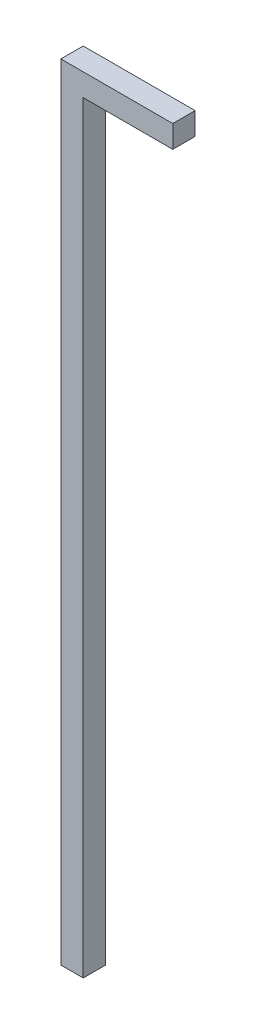
ISO-10303-21;
HEADER;
FILE_DESCRIPTION(('STEP AP214'),'2;1');
FILE_NAME('part.step','',(''),(''),'','','');
FILE_SCHEMA(('AUTOMOTIVE_DESIGN { 1 0 10303 214 1 1 1 1 }'));
ENDSEC;
DATA;
#1=APPLICATION_CONTEXT('core data for automotive mechanical design processes');
#2=APPLICATION_PROTOCOL_DEFINITION('international standard','automotive_design',2000,#1);
#3=PRODUCT_CONTEXT('',#1,'mechanical');
#4=PRODUCT('Part','Part','',(#3));
#5=PRODUCT_RELATED_PRODUCT_CATEGORY('part','',(#4));
#6=PRODUCT_DEFINITION_FORMATION('','',#4);
#7=PRODUCT_DEFINITION_CONTEXT('part definition',#1,'design');
#8=PRODUCT_DEFINITION('design','',#6,#7);
#9=PRODUCT_DEFINITION_SHAPE('','',#8);
#10=(LENGTH_UNIT() NAMED_UNIT(*) SI_UNIT(.MILLI.,.METRE.));
#11=(NAMED_UNIT(*) PLANE_ANGLE_UNIT() SI_UNIT($,.RADIAN.));
#12=(NAMED_UNIT(*) SI_UNIT($,.STERADIAN.) SOLID_ANGLE_UNIT());
#13=UNCERTAINTY_MEASURE_WITH_UNIT(LENGTH_MEASURE(1.E-05),#10,'distance_accuracy_value','');
#14=(GEOMETRIC_REPRESENTATION_CONTEXT(3) GLOBAL_UNCERTAINTY_ASSIGNED_CONTEXT((#13)) GLOBAL_UNIT_ASSIGNED_CONTEXT((#10,
#11,#12)) REPRESENTATION_CONTEXT('',''));
#15=CARTESIAN_POINT('',(0.,0.,0.));
#16=DIRECTION('',(0.,0.,1.));
#17=DIRECTION('',(1.,0.,0.));
#18=AXIS2_PLACEMENT_3D('',#15,#16,#17);
#19=CARTESIAN_POINT('',(-183.974110429448,211.546370143149,20.));
#20=DIRECTION('',(-1.,0.,0.));
#21=DIRECTION('',(0.,0.,1.));
#22=AXIS2_PLACEMENT_3D('',#19,#20,#21);
#23=PLANE('',#22);
#24=DIRECTION('',(0.,1.,0.));
#25=VECTOR('',#24,1.);
#26=CARTESIAN_POINT('',(-183.974110429448,211.546370143149,0.));
#27=LINE('',#26,#25);
#28=CARTESIAN_POINT('',(-183.974110429448,191.546370143149,0.));
#29=VERTEX_POINT('',#28);
#30=CARTESIAN_POINT('',(-183.974110429448,211.546370143149,0.));
#31=VERTEX_POINT('',#30);
#32=EDGE_CURVE('E117',#29,#31,#27,.T.);
#33=ORIENTED_EDGE('',*,*,#32,.T.);
#34=DIRECTION('',(0.,0.,-1.));
#35=VECTOR('',#34,1.);
#36=CARTESIAN_POINT('',(-183.974110429448,211.546370143149,20.));
#37=LINE('',#36,#35);
#38=CARTESIAN_POINT('',(-183.974110429448,211.546370143149,20.));
#39=VERTEX_POINT('',#38);
#40=EDGE_CURVE('E11',#39,#31,#37,.T.);
#41=ORIENTED_EDGE('',*,*,#40,.F.);
#42=DIRECTION('',(0.,1.,0.));
#43=VECTOR('',#42,1.);
#44=CARTESIAN_POINT('',(-183.974110429448,211.546370143149,20.));
#45=LINE('',#44,#43);
#46=CARTESIAN_POINT('',(-183.974110429448,191.546370143149,20.));
#47=VERTEX_POINT('',#46);
#48=EDGE_CURVE('E127',#47,#39,#45,.T.);
#49=ORIENTED_EDGE('',*,*,#48,.F.);
#50=DIRECTION('',(0.,0.,-1.));
#51=VECTOR('',#50,1.);
#52=CARTESIAN_POINT('',(-183.974110429448,191.546370143149,20.));
#53=LINE('',#52,#51);
#54=EDGE_CURVE('E113',#47,#29,#53,.T.);
#55=ORIENTED_EDGE('',*,*,#54,.T.);
#56=EDGE_LOOP('',(#33,#41,#49,#55));
#57=FACE_BOUND('',#56,.T.);
#58=ADVANCED_FACE('F33',(#57),#23,.F.);
#59=CARTESIAN_POINT('',(-183.974110429448,211.546370143149,20.));
#60=DIRECTION('',(0.,-1.,0.));
#61=DIRECTION('',(0.,0.,-1.));
#62=AXIS2_PLACEMENT_3D('',#59,#60,#61);
#63=PLANE('',#62);
#64=DIRECTION('',(-1.,0.,0.));
#65=VECTOR('',#64,1.);
#66=CARTESIAN_POINT('',(-183.974110429448,211.546370143149,0.));
#67=LINE('',#66,#65);
#68=CARTESIAN_POINT('',(-283.974110429448,211.546370143149,0.));
#69=VERTEX_POINT('',#68);
#70=EDGE_CURVE('E120',#31,#69,#67,.T.);
#71=ORIENTED_EDGE('',*,*,#70,.T.);
#72=DIRECTION('',(0.,0.,-1.));
#73=VECTOR('',#72,1.);
#74=CARTESIAN_POINT('',(-283.974110429448,211.546370143149,20.));
#75=LINE('',#74,#73);
#76=CARTESIAN_POINT('',(-283.974110429448,211.546370143149,20.));
#77=VERTEX_POINT('',#76);
#78=EDGE_CURVE('E41',#77,#69,#75,.T.);
#79=ORIENTED_EDGE('',*,*,#78,.F.);
#80=DIRECTION('',(-1.,0.,0.));
#81=VECTOR('',#80,1.);
#82=CARTESIAN_POINT('',(-183.974110429448,211.546370143149,20.));
#83=LINE('',#82,#81);
#84=EDGE_CURVE('E86',#39,#77,#83,.T.);
#85=ORIENTED_EDGE('',*,*,#84,.F.);
#86=ORIENTED_EDGE('',*,*,#40,.T.);
#87=EDGE_LOOP('',(#71,#79,#85,#86));
#88=FACE_BOUND('',#87,.T.);
#89=ADVANCED_FACE('F151',(#88),#63,.F.);
#90=CARTESIAN_POINT('',(-283.974110429448,211.546370143149,20.));
#91=DIRECTION('',(1.,0.,0.));
#92=DIRECTION('',(0.,0.,-1.));
#93=AXIS2_PLACEMENT_3D('',#90,#91,#92);
#94=PLANE('',#93);
#95=DIRECTION('',(0.,-1.,0.));
#96=VECTOR('',#95,1.);
#97=CARTESIAN_POINT('',(-283.974110429448,211.546370143149,0.));
#98=LINE('',#97,#96);
#99=CARTESIAN_POINT('',(-283.974110429448,-489.783629856851,0.));
#100=VERTEX_POINT('',#99);
#101=EDGE_CURVE('E122',#69,#100,#98,.T.);
#102=ORIENTED_EDGE('',*,*,#101,.T.);
#103=DIRECTION('',(0.,0.,-1.));
#104=VECTOR('',#103,1.);
#105=CARTESIAN_POINT('',(-283.974110429448,-489.783629856851,20.));
#106=LINE('',#105,#104);
#107=CARTESIAN_POINT('',(-283.974110429448,-489.783629856851,20.));
#108=VERTEX_POINT('',#107);
#109=EDGE_CURVE('E108',#108,#100,#106,.T.);
#110=ORIENTED_EDGE('',*,*,#109,.F.);
#111=DIRECTION('',(0.,-1.,0.));
#112=VECTOR('',#111,1.);
#113=CARTESIAN_POINT('',(-283.974110429448,211.546370143149,20.));
#114=LINE('',#113,#112);
#115=EDGE_CURVE('E99',#77,#108,#114,.T.);
#116=ORIENTED_EDGE('',*,*,#115,.F.);
#117=ORIENTED_EDGE('',*,*,#78,.T.);
#118=EDGE_LOOP('',(#102,#110,#116,#117));
#119=FACE_BOUND('',#118,.T.);
#120=ADVANCED_FACE('F133',(#119),#94,.F.);
#121=CARTESIAN_POINT('',(-283.974110429448,-489.783629856851,20.));
#122=DIRECTION('',(0.,1.,0.));
#123=DIRECTION('',(0.,0.,1.));
#124=AXIS2_PLACEMENT_3D('',#121,#122,#123);
#125=PLANE('',#124);
#126=DIRECTION('',(1.,0.,0.));
#127=VECTOR('',#126,1.);
#128=CARTESIAN_POINT('',(-283.974110429448,-489.783629856851,0.));
#129=LINE('',#128,#127);
#130=CARTESIAN_POINT('',(-263.974110429448,-489.783629856851,0.));
#131=VERTEX_POINT('',#130);
#132=EDGE_CURVE('E107',#100,#131,#129,.T.);
#133=ORIENTED_EDGE('',*,*,#132,.T.);
#134=DIRECTION('',(0.,0.,-1.));
#135=VECTOR('',#134,1.);
#136=CARTESIAN_POINT('',(-263.974110429448,-489.783629856851,20.));
#137=LINE('',#136,#135);
#138=CARTESIAN_POINT('',(-263.974110429448,-489.783629856851,20.));
#139=VERTEX_POINT('',#138);
#140=EDGE_CURVE('E104',#139,#131,#137,.T.);
#141=ORIENTED_EDGE('',*,*,#140,.F.);
#142=DIRECTION('',(1.,0.,0.));
#143=VECTOR('',#142,1.);
#144=CARTESIAN_POINT('',(-283.974110429448,-489.783629856851,20.));
#145=LINE('',#144,#143);
#146=EDGE_CURVE('E93',#108,#139,#145,.T.);
#147=ORIENTED_EDGE('',*,*,#146,.F.);
#148=ORIENTED_EDGE('',*,*,#109,.T.);
#149=EDGE_LOOP('',(#133,#141,#147,#148));
#150=FACE_BOUND('',#149,.T.);
#151=ADVANCED_FACE('F105',(#150),#125,.F.);
#152=CARTESIAN_POINT('',(-263.974110429448,-489.783629856851,20.));
#153=DIRECTION('',(-1.,0.,0.));
#154=DIRECTION('',(0.,0.,1.));
#155=AXIS2_PLACEMENT_3D('',#152,#153,#154);
#156=PLANE('',#155);
#157=DIRECTION('',(0.,1.,0.));
#158=VECTOR('',#157,1.);
#159=CARTESIAN_POINT('',(-263.974110429448,-489.783629856851,0.));
#160=LINE('',#159,#158);
#161=CARTESIAN_POINT('',(-263.974110429448,191.546370143149,0.));
#162=VERTEX_POINT('',#161);
#163=EDGE_CURVE('E72',#131,#162,#160,.T.);
#164=ORIENTED_EDGE('',*,*,#163,.T.);
#165=DIRECTION('',(0.,0.,-1.));
#166=VECTOR('',#165,1.);
#167=CARTESIAN_POINT('',(-263.974110429448,191.546370143149,20.));
#168=LINE('',#167,#166);
#169=CARTESIAN_POINT('',(-263.974110429448,191.546370143149,20.));
#170=VERTEX_POINT('',#169);
#171=EDGE_CURVE('E109',#170,#162,#168,.T.);
#172=ORIENTED_EDGE('',*,*,#171,.F.);
#173=DIRECTION('',(0.,1.,0.));
#174=VECTOR('',#173,1.);
#175=CARTESIAN_POINT('',(-263.974110429448,-489.783629856851,20.));
#176=LINE('',#175,#174);
#177=EDGE_CURVE('E97',#139,#170,#176,.T.);
#178=ORIENTED_EDGE('',*,*,#177,.F.);
#179=ORIENTED_EDGE('',*,*,#140,.T.);
#180=EDGE_LOOP('',(#164,#172,#178,#179));
#181=FACE_BOUND('',#180,.T.);
#182=ADVANCED_FACE('F111',(#181),#156,.F.);
#183=CARTESIAN_POINT('',(-263.974110429448,191.546370143149,20.));
#184=DIRECTION('',(0.,1.,0.));
#185=DIRECTION('',(0.,0.,1.));
#186=AXIS2_PLACEMENT_3D('',#183,#184,#185);
#187=PLANE('',#186);
#188=DIRECTION('',(1.,0.,0.));
#189=VECTOR('',#188,1.);
#190=CARTESIAN_POINT('',(-263.974110429448,191.546370143149,0.));
#191=LINE('',#190,#189);
#192=EDGE_CURVE('E78',#162,#29,#191,.T.);
#193=ORIENTED_EDGE('',*,*,#192,.T.);
#194=ORIENTED_EDGE('',*,*,#54,.F.);
#195=DIRECTION('',(1.,0.,0.));
#196=VECTOR('',#195,1.);
#197=CARTESIAN_POINT('',(-263.974110429448,191.546370143149,20.));
#198=LINE('',#197,#196);
#199=EDGE_CURVE('E49',#170,#47,#198,.T.);
#200=ORIENTED_EDGE('',*,*,#199,.F.);
#201=ORIENTED_EDGE('',*,*,#171,.T.);
#202=EDGE_LOOP('',(#193,#194,#200,#201));
#203=FACE_BOUND('',#202,.T.);
#204=ADVANCED_FACE('F140',(#203),#187,.F.);
#205=CARTESIAN_POINT('',(0.,0.,20.));
#206=DIRECTION('',(0.,0.,1.));
#207=DIRECTION('',(1.,0.,0.));
#208=AXIS2_PLACEMENT_3D('',#205,#206,#207);
#209=PLANE('',#208);
#210=ORIENTED_EDGE('',*,*,#48,.T.);
#211=ORIENTED_EDGE('',*,*,#84,.T.);
#212=ORIENTED_EDGE('',*,*,#115,.T.);
#213=ORIENTED_EDGE('',*,*,#146,.T.);
#214=ORIENTED_EDGE('',*,*,#177,.T.);
#215=ORIENTED_EDGE('',*,*,#199,.T.);
#216=EDGE_LOOP('',(#210,#211,#212,#213,#214,#215));
#217=FACE_BOUND('',#216,.T.);
#218=ADVANCED_FACE('F95',(#217),#209,.T.);
#219=CARTESIAN_POINT('',(0.,0.,0.));
#220=DIRECTION('',(0.,0.,1.));
#221=DIRECTION('',(1.,0.,0.));
#222=AXIS2_PLACEMENT_3D('',#219,#220,#221);
#223=PLANE('',#222);
#224=ORIENTED_EDGE('',*,*,#32,.F.);
#225=ORIENTED_EDGE('',*,*,#192,.F.);
#226=ORIENTED_EDGE('',*,*,#163,.F.);
#227=ORIENTED_EDGE('',*,*,#132,.F.);
#228=ORIENTED_EDGE('',*,*,#101,.F.);
#229=ORIENTED_EDGE('',*,*,#70,.F.);
#230=EDGE_LOOP('',(#224,#225,#226,#227,#228,#229));
#231=FACE_BOUND('',#230,.T.);
#232=ADVANCED_FACE('F136',(#231),#223,.F.);
#233=CLOSED_SHELL('',(#58,#89,#120,#151,#182,#204,#218,#232));
#234=MANIFOLD_SOLID_BREP('B2',#233);
#235=ADVANCED_BREP_SHAPE_REPRESENTATION('',(#18,#234),#14);
#236=SHAPE_DEFINITION_REPRESENTATION(#9,#235);
ENDSEC;
END-ISO-10303-21;
